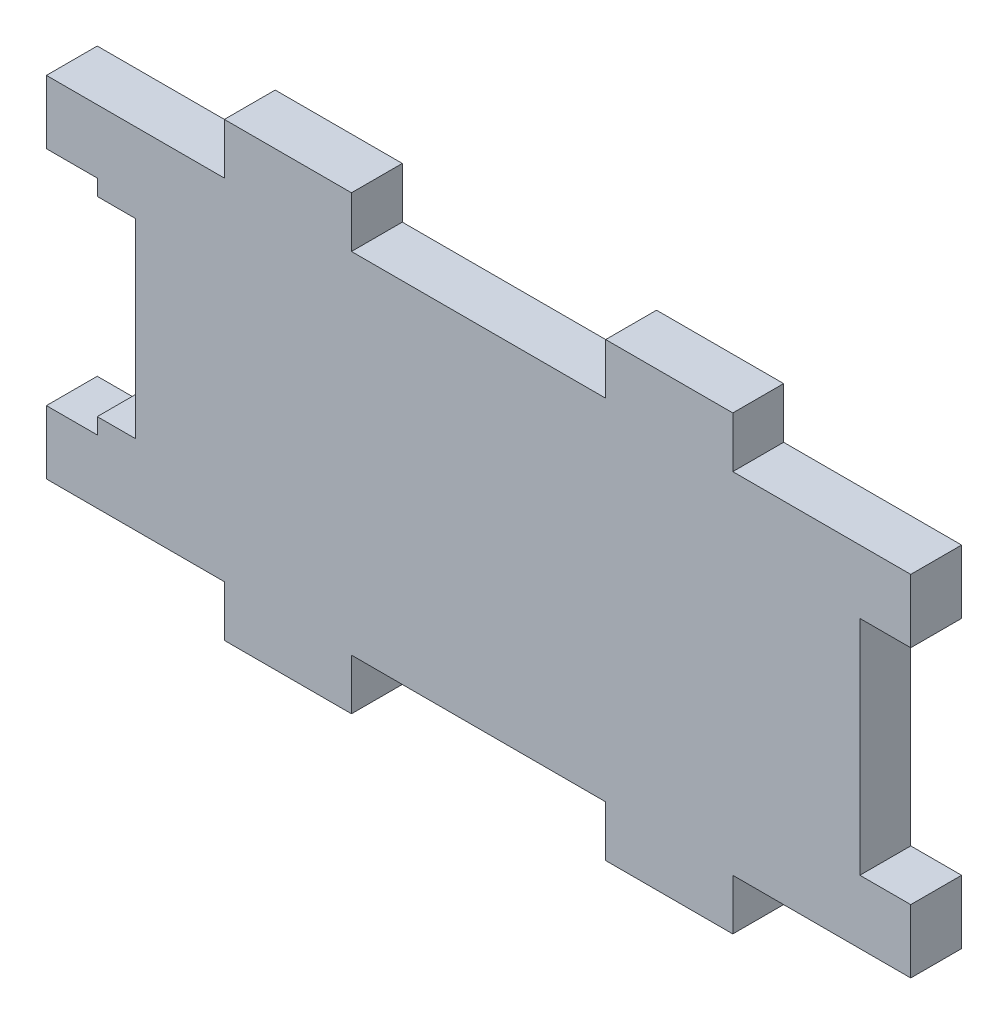
ISO-10303-21;
HEADER;
FILE_DESCRIPTION(('STEP AP214'),'2;1');
FILE_NAME('part.step','',(''),(''),'','','');
FILE_SCHEMA(('AUTOMOTIVE_DESIGN { 1 0 10303 214 1 1 1 1 }'));
ENDSEC;
DATA;
#1=APPLICATION_CONTEXT('core data for automotive mechanical design processes');
#2=APPLICATION_PROTOCOL_DEFINITION('international standard','automotive_design',2000,#1);
#3=PRODUCT_CONTEXT('',#1,'mechanical');
#4=PRODUCT('Part','Part','',(#3));
#5=PRODUCT_RELATED_PRODUCT_CATEGORY('part','',(#4));
#6=PRODUCT_DEFINITION_FORMATION('','',#4);
#7=PRODUCT_DEFINITION_CONTEXT('part definition',#1,'design');
#8=PRODUCT_DEFINITION('design','',#6,#7);
#9=PRODUCT_DEFINITION_SHAPE('','',#8);
#10=(LENGTH_UNIT() NAMED_UNIT(*) SI_UNIT(.MILLI.,.METRE.));
#11=(NAMED_UNIT(*) PLANE_ANGLE_UNIT() SI_UNIT($,.RADIAN.));
#12=(NAMED_UNIT(*) SI_UNIT($,.STERADIAN.) SOLID_ANGLE_UNIT());
#13=UNCERTAINTY_MEASURE_WITH_UNIT(LENGTH_MEASURE(1.E-05),#10,'distance_accuracy_value','');
#14=(GEOMETRIC_REPRESENTATION_CONTEXT(3) GLOBAL_UNCERTAINTY_ASSIGNED_CONTEXT((#13)) GLOBAL_UNIT_ASSIGNED_CONTEXT((#10,
#11,#12)) REPRESENTATION_CONTEXT('',''));
#15=CARTESIAN_POINT('',(0.,0.,0.));
#16=DIRECTION('',(0.,0.,1.));
#17=DIRECTION('',(1.,0.,0.));
#18=AXIS2_PLACEMENT_3D('',#15,#16,#17);
#19=CARTESIAN_POINT('',(-60.,27.5,8.));
#20=DIRECTION('',(0.,-1.,0.));
#21=DIRECTION('',(0.,0.,-1.));
#22=AXIS2_PLACEMENT_3D('',#19,#20,#21);
#23=PLANE('',#22);
#24=DIRECTION('',(-1.,0.,0.));
#25=VECTOR('',#24,1.);
#26=CARTESIAN_POINT('',(-60.,27.5,0.));
#27=LINE('',#26,#25);
#28=CARTESIAN_POINT('',(68.,27.5,0.));
#29=VERTEX_POINT('',#28);
#30=CARTESIAN_POINT('',(40.,27.5,0.));
#31=VERTEX_POINT('',#30);
#32=EDGE_CURVE('E42',#29,#31,#27,.T.);
#33=ORIENTED_EDGE('',*,*,#32,.T.);
#34=DIRECTION('',(0.,0.,1.));
#35=VECTOR('',#34,1.);
#36=CARTESIAN_POINT('',(40.,27.5,8.00000000000001));
#37=LINE('',#36,#35);
#38=CARTESIAN_POINT('',(40.,27.5,8.));
#39=VERTEX_POINT('',#38);
#40=EDGE_CURVE('E309',#31,#39,#37,.T.);
#41=ORIENTED_EDGE('',*,*,#40,.T.);
#42=DIRECTION('',(-1.,0.,0.));
#43=VECTOR('',#42,1.);
#44=CARTESIAN_POINT('',(-60.,27.5,8.));
#45=LINE('',#44,#43);
#46=CARTESIAN_POINT('',(68.,27.5,8.));
#47=VERTEX_POINT('',#46);
#48=EDGE_CURVE('E11',#47,#39,#45,.T.);
#49=ORIENTED_EDGE('',*,*,#48,.F.);
#50=DIRECTION('',(0.,0.,1.));
#51=VECTOR('',#50,1.);
#52=CARTESIAN_POINT('',(68.,27.5,8.));
#53=LINE('',#52,#51);
#54=EDGE_CURVE('E445',#29,#47,#53,.T.);
#55=ORIENTED_EDGE('',*,*,#54,.F.);
#56=EDGE_LOOP('',(#33,#41,#49,#55));
#57=FACE_BOUND('',#56,.T.);
#58=ADVANCED_FACE('F38',(#57),#23,.F.);
#59=CARTESIAN_POINT('',(-40.,27.5,8.));
#60=VERTEX_POINT('',#59);
#61=CARTESIAN_POINT('',(-68.,27.5,8.));
#62=VERTEX_POINT('',#61);
#63=EDGE_CURVE('E49',#60,#62,#45,.T.);
#64=ORIENTED_EDGE('',*,*,#63,.F.);
#65=DIRECTION('',(0.,0.,-1.));
#66=VECTOR('',#65,1.);
#67=CARTESIAN_POINT('',(-40.,27.5,8.));
#68=LINE('',#67,#66);
#69=CARTESIAN_POINT('',(-40.,27.5,0.));
#70=VERTEX_POINT('',#69);
#71=EDGE_CURVE('E338',#60,#70,#68,.T.);
#72=ORIENTED_EDGE('',*,*,#71,.T.);
#73=CARTESIAN_POINT('',(-68.,27.5,0.));
#74=VERTEX_POINT('',#73);
#75=EDGE_CURVE('E491',#70,#74,#27,.T.);
#76=ORIENTED_EDGE('',*,*,#75,.T.);
#77=DIRECTION('',(0.,0.,1.));
#78=VECTOR('',#77,1.);
#79=CARTESIAN_POINT('',(-68.,27.5,8.));
#80=LINE('',#79,#78);
#81=EDGE_CURVE('E292',#74,#62,#80,.T.);
#82=ORIENTED_EDGE('',*,*,#81,.T.);
#83=EDGE_LOOP('',(#64,#72,#76,#82));
#84=FACE_BOUND('',#83,.T.);
#85=ADVANCED_FACE('F558',(#84),#23,.F.);
#86=CARTESIAN_POINT('',(-60.,-27.5,8.));
#87=DIRECTION('',(0.,1.,0.));
#88=DIRECTION('',(0.,0.,1.));
#89=AXIS2_PLACEMENT_3D('',#86,#87,#88);
#90=PLANE('',#89);
#91=DIRECTION('',(0.,0.,-1.));
#92=VECTOR('',#91,1.);
#93=CARTESIAN_POINT('',(20.,-27.5,8.00000000000001));
#94=LINE('',#93,#92);
#95=CARTESIAN_POINT('',(20.,-27.5,8.));
#96=VERTEX_POINT('',#95);
#97=CARTESIAN_POINT('',(20.,-27.5,0.));
#98=VERTEX_POINT('',#97);
#99=EDGE_CURVE('E366',#96,#98,#94,.T.);
#100=ORIENTED_EDGE('',*,*,#99,.F.);
#101=DIRECTION('',(1.,0.,0.));
#102=VECTOR('',#101,1.);
#103=CARTESIAN_POINT('',(-60.,-27.5,8.));
#104=LINE('',#103,#102);
#105=CARTESIAN_POINT('',(-20.,-27.5,8.));
#106=VERTEX_POINT('',#105);
#107=EDGE_CURVE('E263',#106,#96,#104,.T.);
#108=ORIENTED_EDGE('',*,*,#107,.F.);
#109=DIRECTION('',(0.,0.,1.));
#110=VECTOR('',#109,1.);
#111=CARTESIAN_POINT('',(-20.,-27.5,8.));
#112=LINE('',#111,#110);
#113=CARTESIAN_POINT('',(-20.,-27.5,0.));
#114=VERTEX_POINT('',#113);
#115=EDGE_CURVE('E397',#114,#106,#112,.T.);
#116=ORIENTED_EDGE('',*,*,#115,.F.);
#117=DIRECTION('',(1.,0.,0.));
#118=VECTOR('',#117,1.);
#119=CARTESIAN_POINT('',(-60.,-27.5,0.));
#120=LINE('',#119,#118);
#121=EDGE_CURVE('E490',#114,#98,#120,.T.);
#122=ORIENTED_EDGE('',*,*,#121,.T.);
#123=EDGE_LOOP('',(#100,#108,#116,#122));
#124=FACE_BOUND('',#123,.T.);
#125=ADVANCED_FACE('F523',(#124),#90,.F.);
#126=DIRECTION('',(0.,0.,1.));
#127=VECTOR('',#126,1.);
#128=CARTESIAN_POINT('',(40.,-27.5,8.00000000000001));
#129=LINE('',#128,#127);
#130=CARTESIAN_POINT('',(40.,-27.5,0.));
#131=VERTEX_POINT('',#130);
#132=CARTESIAN_POINT('',(40.,-27.5,8.));
#133=VERTEX_POINT('',#132);
#134=EDGE_CURVE('E371',#131,#133,#129,.T.);
#135=ORIENTED_EDGE('',*,*,#134,.F.);
#136=CARTESIAN_POINT('',(68.,-27.5,0.));
#137=VERTEX_POINT('',#136);
#138=EDGE_CURVE('E487',#131,#137,#120,.T.);
#139=ORIENTED_EDGE('',*,*,#138,.T.);
#140=DIRECTION('',(0.,0.,-1.));
#141=VECTOR('',#140,1.);
#142=CARTESIAN_POINT('',(68.,-27.5,8.));
#143=LINE('',#142,#141);
#144=CARTESIAN_POINT('',(68.,-27.5,8.));
#145=VERTEX_POINT('',#144);
#146=EDGE_CURVE('E418',#145,#137,#143,.T.);
#147=ORIENTED_EDGE('',*,*,#146,.F.);
#148=EDGE_CURVE('E265',#133,#145,#104,.T.);
#149=ORIENTED_EDGE('',*,*,#148,.F.);
#150=EDGE_LOOP('',(#135,#139,#147,#149));
#151=FACE_BOUND('',#150,.T.);
#152=ADVANCED_FACE('F530',(#151),#90,.F.);
#153=DIRECTION('',(0.,0.,-1.));
#154=VECTOR('',#153,1.);
#155=CARTESIAN_POINT('',(-40.,-27.5,8.));
#156=LINE('',#155,#154);
#157=CARTESIAN_POINT('',(-40.,-27.5,8.));
#158=VERTEX_POINT('',#157);
#159=CARTESIAN_POINT('',(-40.,-27.5,0.));
#160=VERTEX_POINT('',#159);
#161=EDGE_CURVE('E257',#158,#160,#156,.T.);
#162=ORIENTED_EDGE('',*,*,#161,.F.);
#163=CARTESIAN_POINT('',(-68.,-27.5,8.));
#164=VERTEX_POINT('',#163);
#165=EDGE_CURVE('E251',#164,#158,#104,.T.);
#166=ORIENTED_EDGE('',*,*,#165,.F.);
#167=DIRECTION('',(0.,0.,-1.));
#168=VECTOR('',#167,1.);
#169=CARTESIAN_POINT('',(-68.,-27.5,8.));
#170=LINE('',#169,#168);
#171=CARTESIAN_POINT('',(-68.,-27.5,0.));
#172=VERTEX_POINT('',#171);
#173=EDGE_CURVE('E254',#164,#172,#170,.T.);
#174=ORIENTED_EDGE('',*,*,#173,.T.);
#175=EDGE_CURVE('E488',#172,#160,#120,.T.);
#176=ORIENTED_EDGE('',*,*,#175,.T.);
#177=EDGE_LOOP('',(#162,#166,#174,#176));
#178=FACE_BOUND('',#177,.T.);
#179=ADVANCED_FACE('F253',(#178),#90,.F.);
#180=CARTESIAN_POINT('',(60.,27.5,8.));
#181=DIRECTION('',(-1.,0.,0.));
#182=DIRECTION('',(0.,0.,1.));
#183=AXIS2_PLACEMENT_3D('',#180,#181,#182);
#184=PLANE('',#183);
#185=DIRECTION('',(0.,0.,1.));
#186=VECTOR('',#185,1.);
#187=CARTESIAN_POINT('',(60.,-17.5,8.));
#188=LINE('',#187,#186);
#189=CARTESIAN_POINT('',(60.,-17.5,0.));
#190=VERTEX_POINT('',#189);
#191=CARTESIAN_POINT('',(60.,-17.5,8.));
#192=VERTEX_POINT('',#191);
#193=EDGE_CURVE('E417',#190,#192,#188,.T.);
#194=ORIENTED_EDGE('',*,*,#193,.F.);
#195=DIRECTION('',(0.,1.,0.));
#196=VECTOR('',#195,1.);
#197=CARTESIAN_POINT('',(60.,27.5,0.));
#198=LINE('',#197,#196);
#199=CARTESIAN_POINT('',(60.,17.5,0.));
#200=VERTEX_POINT('',#199);
#201=EDGE_CURVE('E489',#190,#200,#198,.T.);
#202=ORIENTED_EDGE('',*,*,#201,.T.);
#203=DIRECTION('',(0.,0.,-1.));
#204=VECTOR('',#203,1.);
#205=CARTESIAN_POINT('',(60.,17.5,8.));
#206=LINE('',#205,#204);
#207=CARTESIAN_POINT('',(60.,17.5,8.));
#208=VERTEX_POINT('',#207);
#209=EDGE_CURVE('E436',#208,#200,#206,.T.);
#210=ORIENTED_EDGE('',*,*,#209,.F.);
#211=DIRECTION('',(0.,1.,0.));
#212=VECTOR('',#211,1.);
#213=CARTESIAN_POINT('',(60.,27.5,8.));
#214=LINE('',#213,#212);
#215=EDGE_CURVE('E262',#192,#208,#214,.T.);
#216=ORIENTED_EDGE('',*,*,#215,.F.);
#217=EDGE_LOOP('',(#194,#202,#210,#216));
#218=FACE_BOUND('',#217,.T.);
#219=ADVANCED_FACE('F595',(#218),#184,.F.);
#220=CARTESIAN_POINT('',(-60.,27.5,8.));
#221=DIRECTION('',(1.,0.,0.));
#222=DIRECTION('',(0.,0.,-1.));
#223=AXIS2_PLACEMENT_3D('',#220,#221,#222);
#224=PLANE('',#223);
#225=DIRECTION('',(0.,-1.,0.));
#226=VECTOR('',#225,1.);
#227=CARTESIAN_POINT('',(-60.,27.5,8.));
#228=LINE('',#227,#226);
#229=CARTESIAN_POINT('',(-60.,17.5,8.));
#230=VERTEX_POINT('',#229);
#231=CARTESIAN_POINT('',(-60.,15.,8.));
#232=VERTEX_POINT('',#231);
#233=EDGE_CURVE('E481',#230,#232,#228,.T.);
#234=ORIENTED_EDGE('',*,*,#233,.F.);
#235=DIRECTION('',(0.,0.,-1.));
#236=VECTOR('',#235,1.);
#237=CARTESIAN_POINT('',(-60.,17.5,8.));
#238=LINE('',#237,#236);
#239=CARTESIAN_POINT('',(-60.,17.5,0.));
#240=VERTEX_POINT('',#239);
#241=EDGE_CURVE('E288',#230,#240,#238,.T.);
#242=ORIENTED_EDGE('',*,*,#241,.T.);
#243=DIRECTION('',(0.,-1.,0.));
#244=VECTOR('',#243,1.);
#245=CARTESIAN_POINT('',(-60.,27.5,0.));
#246=LINE('',#245,#244);
#247=CARTESIAN_POINT('',(-60.,15.,0.));
#248=VERTEX_POINT('',#247);
#249=EDGE_CURVE('E485',#240,#248,#246,.T.);
#250=ORIENTED_EDGE('',*,*,#249,.T.);
#251=DIRECTION('',(0.,0.,-1.));
#252=VECTOR('',#251,1.);
#253=CARTESIAN_POINT('',(-60.,15.,-0.000999999999999265));
#254=LINE('',#253,#252);
#255=EDGE_CURVE('E458',#232,#248,#254,.T.);
#256=ORIENTED_EDGE('',*,*,#255,.F.);
#257=EDGE_LOOP('',(#234,#242,#250,#256));
#258=FACE_BOUND('',#257,.T.);
#259=ADVANCED_FACE('F573',(#258),#224,.F.);
#260=CARTESIAN_POINT('',(-60.,-15.,0.));
#261=VERTEX_POINT('',#260);
#262=CARTESIAN_POINT('',(-60.,-17.5,0.));
#263=VERTEX_POINT('',#262);
#264=EDGE_CURVE('E61',#261,#263,#246,.T.);
#265=ORIENTED_EDGE('',*,*,#264,.T.);
#266=DIRECTION('',(0.,0.,1.));
#267=VECTOR('',#266,1.);
#268=CARTESIAN_POINT('',(-60.,-17.5,8.));
#269=LINE('',#268,#267);
#270=CARTESIAN_POINT('',(-60.,-17.5,8.));
#271=VERTEX_POINT('',#270);
#272=EDGE_CURVE('E56',#263,#271,#269,.T.);
#273=ORIENTED_EDGE('',*,*,#272,.T.);
#274=CARTESIAN_POINT('',(-60.,-15.,8.));
#275=VERTEX_POINT('',#274);
#276=EDGE_CURVE('E482',#275,#271,#228,.T.);
#277=ORIENTED_EDGE('',*,*,#276,.F.);
#278=DIRECTION('',(0.,0.,1.));
#279=VECTOR('',#278,1.);
#280=CARTESIAN_POINT('',(-60.,-15.,-0.000999999999999265));
#281=LINE('',#280,#279);
#282=EDGE_CURVE('E456',#261,#275,#281,.T.);
#283=ORIENTED_EDGE('',*,*,#282,.F.);
#284=EDGE_LOOP('',(#265,#273,#277,#283));
#285=FACE_BOUND('',#284,.T.);
#286=ADVANCED_FACE('F40',(#285),#224,.F.);
#287=CARTESIAN_POINT('',(20.,27.5,8.));
#288=VERTEX_POINT('',#287);
#289=CARTESIAN_POINT('',(-20.,27.5,8.));
#290=VERTEX_POINT('',#289);
#291=EDGE_CURVE('E47',#288,#290,#45,.T.);
#292=ORIENTED_EDGE('',*,*,#291,.F.);
#293=DIRECTION('',(0.,0.,-1.));
#294=VECTOR('',#293,1.);
#295=CARTESIAN_POINT('',(20.,27.5,8.00000000000001));
#296=LINE('',#295,#294);
#297=CARTESIAN_POINT('',(20.,27.5,0.));
#298=VERTEX_POINT('',#297);
#299=EDGE_CURVE('E314',#288,#298,#296,.T.);
#300=ORIENTED_EDGE('',*,*,#299,.T.);
#301=CARTESIAN_POINT('',(-20.,27.5,0.));
#302=VERTEX_POINT('',#301);
#303=EDGE_CURVE('E495',#298,#302,#27,.T.);
#304=ORIENTED_EDGE('',*,*,#303,.T.);
#305=DIRECTION('',(0.,0.,1.));
#306=VECTOR('',#305,1.);
#307=CARTESIAN_POINT('',(-20.,27.5,8.));
#308=LINE('',#307,#306);
#309=EDGE_CURVE('E343',#302,#290,#308,.T.);
#310=ORIENTED_EDGE('',*,*,#309,.T.);
#311=EDGE_LOOP('',(#292,#300,#304,#310));
#312=FACE_BOUND('',#311,.T.);
#313=ADVANCED_FACE('F560',(#312),#23,.F.);
#314=CARTESIAN_POINT('',(0.,0.,8.));
#315=DIRECTION('',(0.,0.,1.));
#316=DIRECTION('',(1.,0.,0.));
#317=AXIS2_PLACEMENT_3D('',#314,#315,#316);
#318=PLANE('',#317);
#319=DIRECTION('',(-1.,0.,0.));
#320=VECTOR('',#319,1.);
#321=CARTESIAN_POINT('',(-92.7508153269363,15.,8.));
#322=LINE('',#321,#320);
#323=CARTESIAN_POINT('',(-54.,15.,8.));
#324=VERTEX_POINT('',#323);
#325=EDGE_CURVE('E472',#324,#232,#322,.T.);
#326=ORIENTED_EDGE('',*,*,#325,.F.);
#327=DIRECTION('',(0.,1.,0.));
#328=VECTOR('',#327,1.);
#329=CARTESIAN_POINT('',(-54.,15.,8.));
#330=LINE('',#329,#328);
#331=CARTESIAN_POINT('',(-54.,-15.,8.));
#332=VERTEX_POINT('',#331);
#333=EDGE_CURVE('E469',#332,#324,#330,.T.);
#334=ORIENTED_EDGE('',*,*,#333,.F.);
#335=DIRECTION('',(1.,0.,0.));
#336=VECTOR('',#335,1.);
#337=CARTESIAN_POINT('',(-92.7508153269363,-15.,8.));
#338=LINE('',#337,#336);
#339=EDGE_CURVE('E466',#275,#332,#338,.T.);
#340=ORIENTED_EDGE('',*,*,#339,.F.);
#341=ORIENTED_EDGE('',*,*,#276,.T.);
#342=DIRECTION('',(1.,0.,0.));
#343=VECTOR('',#342,1.);
#344=CARTESIAN_POINT('',(-68.,-17.5,8.));
#345=LINE('',#344,#343);
#346=CARTESIAN_POINT('',(-68.,-17.5,8.));
#347=VERTEX_POINT('',#346);
#348=EDGE_CURVE('E278',#347,#271,#345,.T.);
#349=ORIENTED_EDGE('',*,*,#348,.F.);
#350=DIRECTION('',(0.,-1.,0.));
#351=VECTOR('',#350,1.);
#352=CARTESIAN_POINT('',(-68.,-27.5,8.));
#353=LINE('',#352,#351);
#354=EDGE_CURVE('E270',#347,#164,#353,.T.);
#355=ORIENTED_EDGE('',*,*,#354,.T.);
#356=ORIENTED_EDGE('',*,*,#165,.T.);
#357=DIRECTION('',(0.,1.,0.));
#358=VECTOR('',#357,1.);
#359=CARTESIAN_POINT('',(-40.,-35.5,8.));
#360=LINE('',#359,#358);
#361=CARTESIAN_POINT('',(-40.,-35.5,8.));
#362=VERTEX_POINT('',#361);
#363=EDGE_CURVE('E403',#362,#158,#360,.T.);
#364=ORIENTED_EDGE('',*,*,#363,.F.);
#365=DIRECTION('',(-1.,0.,0.));
#366=VECTOR('',#365,1.);
#367=CARTESIAN_POINT('',(-40.,-35.5,8.));
#368=LINE('',#367,#366);
#369=CARTESIAN_POINT('',(-20.,-35.5,8.));
#370=VERTEX_POINT('',#369);
#371=EDGE_CURVE('E401',#370,#362,#368,.T.);
#372=ORIENTED_EDGE('',*,*,#371,.F.);
#373=DIRECTION('',(0.,1.,0.));
#374=VECTOR('',#373,1.);
#375=CARTESIAN_POINT('',(-20.,-35.5,8.));
#376=LINE('',#375,#374);
#377=EDGE_CURVE('E408',#370,#106,#376,.T.);
#378=ORIENTED_EDGE('',*,*,#377,.T.);
#379=ORIENTED_EDGE('',*,*,#107,.T.);
#380=DIRECTION('',(0.,1.,0.));
#381=VECTOR('',#380,1.);
#382=CARTESIAN_POINT('',(20.,-35.5,8.00000000000001));
#383=LINE('',#382,#381);
#384=CARTESIAN_POINT('',(20.,-35.5,8.00000000000001));
#385=VERTEX_POINT('',#384);
#386=EDGE_CURVE('E390',#385,#96,#383,.T.);
#387=ORIENTED_EDGE('',*,*,#386,.F.);
#388=DIRECTION('',(-1.,0.,0.));
#389=VECTOR('',#388,1.);
#390=CARTESIAN_POINT('',(40.,-35.5,8.00000000000001));
#391=LINE('',#390,#389);
#392=CARTESIAN_POINT('',(40.,-35.5,8.00000000000001));
#393=VERTEX_POINT('',#392);
#394=EDGE_CURVE('E367',#393,#385,#391,.T.);
#395=ORIENTED_EDGE('',*,*,#394,.F.);
#396=DIRECTION('',(0.,1.,0.));
#397=VECTOR('',#396,1.);
#398=CARTESIAN_POINT('',(40.,-35.5,8.00000000000001));
#399=LINE('',#398,#397);
#400=EDGE_CURVE('E377',#393,#133,#399,.T.);
#401=ORIENTED_EDGE('',*,*,#400,.T.);
#402=ORIENTED_EDGE('',*,*,#148,.T.);
#403=DIRECTION('',(0.,-1.,0.));
#404=VECTOR('',#403,1.);
#405=CARTESIAN_POINT('',(68.,-27.5,8.));
#406=LINE('',#405,#404);
#407=CARTESIAN_POINT('',(68.,-17.5,8.));
#408=VERTEX_POINT('',#407);
#409=EDGE_CURVE('E425',#408,#145,#406,.T.);
#410=ORIENTED_EDGE('',*,*,#409,.F.);
#411=DIRECTION('',(-1.,0.,0.));
#412=VECTOR('',#411,1.);
#413=CARTESIAN_POINT('',(68.,-17.5,8.));
#414=LINE('',#413,#412);
#415=EDGE_CURVE('E428',#408,#192,#414,.T.);
#416=ORIENTED_EDGE('',*,*,#415,.T.);
#417=ORIENTED_EDGE('',*,*,#215,.T.);
#418=DIRECTION('',(-1.,0.,0.));
#419=VECTOR('',#418,1.);
#420=CARTESIAN_POINT('',(68.,17.5,8.));
#421=LINE('',#420,#419);
#422=CARTESIAN_POINT('',(68.,17.5,8.));
#423=VERTEX_POINT('',#422);
#424=EDGE_CURVE('E453',#423,#208,#421,.T.);
#425=ORIENTED_EDGE('',*,*,#424,.F.);
#426=DIRECTION('',(0.,-1.,0.));
#427=VECTOR('',#426,1.);
#428=CARTESIAN_POINT('',(68.,27.5,8.));
#429=LINE('',#428,#427);
#430=EDGE_CURVE('E437',#47,#423,#429,.T.);
#431=ORIENTED_EDGE('',*,*,#430,.F.);
#432=ORIENTED_EDGE('',*,*,#48,.T.);
#433=DIRECTION('',(0.,-1.,0.));
#434=VECTOR('',#433,1.);
#435=CARTESIAN_POINT('',(40.,35.5,8.00000000000001));
#436=LINE('',#435,#434);
#437=CARTESIAN_POINT('',(40.,35.5,8.00000000000001));
#438=VERTEX_POINT('',#437);
#439=EDGE_CURVE('E335',#438,#39,#436,.T.);
#440=ORIENTED_EDGE('',*,*,#439,.F.);
#441=DIRECTION('',(-1.,0.,0.));
#442=VECTOR('',#441,1.);
#443=CARTESIAN_POINT('',(40.,35.5,8.00000000000001));
#444=LINE('',#443,#442);
#445=CARTESIAN_POINT('',(20.,35.5,8.00000000000001));
#446=VERTEX_POINT('',#445);
#447=EDGE_CURVE('E310',#438,#446,#444,.T.);
#448=ORIENTED_EDGE('',*,*,#447,.T.);
#449=DIRECTION('',(0.,-1.,0.));
#450=VECTOR('',#449,1.);
#451=CARTESIAN_POINT('',(20.,35.5,8.00000000000001));
#452=LINE('',#451,#450);
#453=EDGE_CURVE('E323',#446,#288,#452,.T.);
#454=ORIENTED_EDGE('',*,*,#453,.T.);
#455=ORIENTED_EDGE('',*,*,#291,.T.);
#456=DIRECTION('',(0.,-1.,0.));
#457=VECTOR('',#456,1.);
#458=CARTESIAN_POINT('',(-20.,35.5,8.));
#459=LINE('',#458,#457);
#460=CARTESIAN_POINT('',(-20.,35.5,8.));
#461=VERTEX_POINT('',#460);
#462=EDGE_CURVE('E361',#461,#290,#459,.T.);
#463=ORIENTED_EDGE('',*,*,#462,.F.);
#464=DIRECTION('',(-1.,0.,0.));
#465=VECTOR('',#464,1.);
#466=CARTESIAN_POINT('',(-40.,35.5,8.));
#467=LINE('',#466,#465);
#468=CARTESIAN_POINT('',(-40.,35.5,8.));
#469=VERTEX_POINT('',#468);
#470=EDGE_CURVE('E342',#461,#469,#467,.T.);
#471=ORIENTED_EDGE('',*,*,#470,.T.);
#472=DIRECTION('',(0.,-1.,0.));
#473=VECTOR('',#472,1.);
#474=CARTESIAN_POINT('',(-40.,35.5,8.));
#475=LINE('',#474,#473);
#476=EDGE_CURVE('E364',#469,#60,#475,.T.);
#477=ORIENTED_EDGE('',*,*,#476,.T.);
#478=ORIENTED_EDGE('',*,*,#63,.T.);
#479=DIRECTION('',(0.,-1.,0.));
#480=VECTOR('',#479,1.);
#481=CARTESIAN_POINT('',(-68.,27.5,8.));
#482=LINE('',#481,#480);
#483=CARTESIAN_POINT('',(-68.,17.5,8.));
#484=VERTEX_POINT('',#483);
#485=EDGE_CURVE('E289',#62,#484,#482,.T.);
#486=ORIENTED_EDGE('',*,*,#485,.T.);
#487=DIRECTION('',(1.,0.,0.));
#488=VECTOR('',#487,1.);
#489=CARTESIAN_POINT('',(-68.,17.5,8.));
#490=LINE('',#489,#488);
#491=EDGE_CURVE('E301',#484,#230,#490,.T.);
#492=ORIENTED_EDGE('',*,*,#491,.T.);
#493=ORIENTED_EDGE('',*,*,#233,.T.);
#494=EDGE_LOOP('',(#326,#334,#340,#341,#349,#355,#356,#364,#372,#378,#379,#387,#395,#401,#402,
#410,#416,#417,#425,#431,#432,#440,#448,#454,#455,#463,#471,#477,#478,#486,#492,#493));
#495=FACE_BOUND('',#494,.T.);
#496=ADVANCED_FACE('F276',(#495),#318,.T.);
#497=CARTESIAN_POINT('',(0.,0.,0.));
#498=DIRECTION('',(0.,0.,1.));
#499=DIRECTION('',(1.,0.,0.));
#500=AXIS2_PLACEMENT_3D('',#497,#498,#499);
#501=PLANE('',#500);
#502=DIRECTION('',(0.,-1.,0.));
#503=VECTOR('',#502,1.);
#504=CARTESIAN_POINT('',(-54.,15.,0.));
#505=LINE('',#504,#503);
#506=CARTESIAN_POINT('',(-54.,15.,0.));
#507=VERTEX_POINT('',#506);
#508=CARTESIAN_POINT('',(-54.,-15.,0.));
#509=VERTEX_POINT('',#508);
#510=EDGE_CURVE('E461',#507,#509,#505,.T.);
#511=ORIENTED_EDGE('',*,*,#510,.F.);
#512=DIRECTION('',(1.,0.,0.));
#513=VECTOR('',#512,1.);
#514=CARTESIAN_POINT('',(-92.7508153269363,15.,0.));
#515=LINE('',#514,#513);
#516=EDGE_CURVE('E463',#248,#507,#515,.T.);
#517=ORIENTED_EDGE('',*,*,#516,.F.);
#518=ORIENTED_EDGE('',*,*,#249,.F.);
#519=DIRECTION('',(1.,0.,0.));
#520=VECTOR('',#519,1.);
#521=CARTESIAN_POINT('',(-68.,17.5,0.));
#522=LINE('',#521,#520);
#523=CARTESIAN_POINT('',(-68.,17.5,0.));
#524=VERTEX_POINT('',#523);
#525=EDGE_CURVE('E306',#524,#240,#522,.T.);
#526=ORIENTED_EDGE('',*,*,#525,.F.);
#527=DIRECTION('',(0.,1.,0.));
#528=VECTOR('',#527,1.);
#529=CARTESIAN_POINT('',(-68.,27.5,0.));
#530=LINE('',#529,#528);
#531=EDGE_CURVE('E295',#524,#74,#530,.T.);
#532=ORIENTED_EDGE('',*,*,#531,.T.);
#533=ORIENTED_EDGE('',*,*,#75,.F.);
#534=DIRECTION('',(0.,-1.,0.));
#535=VECTOR('',#534,1.);
#536=CARTESIAN_POINT('',(-40.,35.5,0.));
#537=LINE('',#536,#535);
#538=CARTESIAN_POINT('',(-40.,35.5,0.));
#539=VERTEX_POINT('',#538);
#540=EDGE_CURVE('E352',#539,#70,#537,.T.);
#541=ORIENTED_EDGE('',*,*,#540,.F.);
#542=DIRECTION('',(1.,0.,0.));
#543=VECTOR('',#542,1.);
#544=CARTESIAN_POINT('',(-40.,35.5,0.));
#545=LINE('',#544,#543);
#546=CARTESIAN_POINT('',(-20.,35.5,0.));
#547=VERTEX_POINT('',#546);
#548=EDGE_CURVE('E349',#539,#547,#545,.T.);
#549=ORIENTED_EDGE('',*,*,#548,.T.);
#550=DIRECTION('',(0.,-1.,0.));
#551=VECTOR('',#550,1.);
#552=CARTESIAN_POINT('',(-20.,35.5,0.));
#553=LINE('',#552,#551);
#554=EDGE_CURVE('E358',#547,#302,#553,.T.);
#555=ORIENTED_EDGE('',*,*,#554,.T.);
#556=ORIENTED_EDGE('',*,*,#303,.F.);
#557=DIRECTION('',(0.,-1.,0.));
#558=VECTOR('',#557,1.);
#559=CARTESIAN_POINT('',(20.,35.5,0.));
#560=LINE('',#559,#558);
#561=CARTESIAN_POINT('',(20.,35.5,0.));
#562=VERTEX_POINT('',#561);
#563=EDGE_CURVE('E329',#562,#298,#560,.T.);
#564=ORIENTED_EDGE('',*,*,#563,.F.);
#565=DIRECTION('',(1.,0.,0.));
#566=VECTOR('',#565,1.);
#567=CARTESIAN_POINT('',(40.,35.5,0.));
#568=LINE('',#567,#566);
#569=CARTESIAN_POINT('',(40.,35.5,0.));
#570=VERTEX_POINT('',#569);
#571=EDGE_CURVE('E317',#562,#570,#568,.T.);
#572=ORIENTED_EDGE('',*,*,#571,.T.);
#573=DIRECTION('',(0.,-1.,0.));
#574=VECTOR('',#573,1.);
#575=CARTESIAN_POINT('',(40.,35.5,0.));
#576=LINE('',#575,#574);
#577=EDGE_CURVE('E332',#570,#31,#576,.T.);
#578=ORIENTED_EDGE('',*,*,#577,.T.);
#579=ORIENTED_EDGE('',*,*,#32,.F.);
#580=DIRECTION('',(0.,1.,0.));
#581=VECTOR('',#580,1.);
#582=CARTESIAN_POINT('',(68.,27.5,0.));
#583=LINE('',#582,#581);
#584=CARTESIAN_POINT('',(68.,17.5,0.));
#585=VERTEX_POINT('',#584);
#586=EDGE_CURVE('E442',#585,#29,#583,.T.);
#587=ORIENTED_EDGE('',*,*,#586,.F.);
#588=DIRECTION('',(-1.,0.,0.));
#589=VECTOR('',#588,1.);
#590=CARTESIAN_POINT('',(68.,17.5,0.));
#591=LINE('',#590,#589);
#592=EDGE_CURVE('E448',#585,#200,#591,.T.);
#593=ORIENTED_EDGE('',*,*,#592,.T.);
#594=ORIENTED_EDGE('',*,*,#201,.F.);
#595=DIRECTION('',(-1.,0.,0.));
#596=VECTOR('',#595,1.);
#597=CARTESIAN_POINT('',(68.,-17.5,0.));
#598=LINE('',#597,#596);
#599=CARTESIAN_POINT('',(68.,-17.5,0.));
#600=VERTEX_POINT('',#599);
#601=EDGE_CURVE('E433',#600,#190,#598,.T.);
#602=ORIENTED_EDGE('',*,*,#601,.F.);
#603=DIRECTION('',(0.,1.,0.));
#604=VECTOR('',#603,1.);
#605=CARTESIAN_POINT('',(68.,-27.5,0.));
#606=LINE('',#605,#604);
#607=EDGE_CURVE('E421',#137,#600,#606,.T.);
#608=ORIENTED_EDGE('',*,*,#607,.F.);
#609=ORIENTED_EDGE('',*,*,#138,.F.);
#610=DIRECTION('',(0.,1.,0.));
#611=VECTOR('',#610,1.);
#612=CARTESIAN_POINT('',(40.,-35.5,0.));
#613=LINE('',#612,#611);
#614=CARTESIAN_POINT('',(40.,-35.5,0.));
#615=VERTEX_POINT('',#614);
#616=EDGE_CURVE('E384',#615,#131,#613,.T.);
#617=ORIENTED_EDGE('',*,*,#616,.F.);
#618=DIRECTION('',(1.,0.,0.));
#619=VECTOR('',#618,1.);
#620=CARTESIAN_POINT('',(40.,-35.5,0.));
#621=LINE('',#620,#619);
#622=CARTESIAN_POINT('',(20.,-35.5,0.));
#623=VERTEX_POINT('',#622);
#624=EDGE_CURVE('E373',#623,#615,#621,.T.);
#625=ORIENTED_EDGE('',*,*,#624,.F.);
#626=DIRECTION('',(0.,1.,0.));
#627=VECTOR('',#626,1.);
#628=CARTESIAN_POINT('',(20.,-35.5,0.));
#629=LINE('',#628,#627);
#630=EDGE_CURVE('E387',#623,#98,#629,.T.);
#631=ORIENTED_EDGE('',*,*,#630,.T.);
#632=ORIENTED_EDGE('',*,*,#121,.F.);
#633=DIRECTION('',(0.,1.,0.));
#634=VECTOR('',#633,1.);
#635=CARTESIAN_POINT('',(-20.,-35.5,0.));
#636=LINE('',#635,#634);
#637=CARTESIAN_POINT('',(-20.,-35.5,0.));
#638=VERTEX_POINT('',#637);
#639=EDGE_CURVE('E411',#638,#114,#636,.T.);
#640=ORIENTED_EDGE('',*,*,#639,.F.);
#641=DIRECTION('',(1.,0.,0.));
#642=VECTOR('',#641,1.);
#643=CARTESIAN_POINT('',(-40.,-35.5,0.));
#644=LINE('',#643,#642);
#645=CARTESIAN_POINT('',(-40.,-35.5,0.));
#646=VERTEX_POINT('',#645);
#647=EDGE_CURVE('E396',#646,#638,#644,.T.);
#648=ORIENTED_EDGE('',*,*,#647,.F.);
#649=DIRECTION('',(0.,1.,0.));
#650=VECTOR('',#649,1.);
#651=CARTESIAN_POINT('',(-40.,-35.5,0.));
#652=LINE('',#651,#650);
#653=EDGE_CURVE('E414',#646,#160,#652,.T.);
#654=ORIENTED_EDGE('',*,*,#653,.T.);
#655=ORIENTED_EDGE('',*,*,#175,.F.);
#656=DIRECTION('',(0.,1.,0.));
#657=VECTOR('',#656,1.);
#658=CARTESIAN_POINT('',(-68.,-27.5,0.));
#659=LINE('',#658,#657);
#660=CARTESIAN_POINT('',(-68.,-17.5,0.));
#661=VERTEX_POINT('',#660);
#662=EDGE_CURVE('E273',#172,#661,#659,.T.);
#663=ORIENTED_EDGE('',*,*,#662,.T.);
#664=DIRECTION('',(1.,0.,0.));
#665=VECTOR('',#664,1.);
#666=CARTESIAN_POINT('',(-68.,-17.5,0.));
#667=LINE('',#666,#665);
#668=EDGE_CURVE('E284',#661,#263,#667,.T.);
#669=ORIENTED_EDGE('',*,*,#668,.T.);
#670=ORIENTED_EDGE('',*,*,#264,.F.);
#671=DIRECTION('',(-1.,0.,0.));
#672=VECTOR('',#671,1.);
#673=CARTESIAN_POINT('',(-92.7508153269363,-15.,0.));
#674=LINE('',#673,#672);
#675=EDGE_CURVE('E478',#509,#261,#674,.T.);
#676=ORIENTED_EDGE('',*,*,#675,.F.);
#677=EDGE_LOOP('',(#511,#517,#518,#526,#532,#533,#541,#549,#555,#556,#564,#572,#578,#579,#587,
#593,#594,#602,#608,#609,#617,#625,#631,#632,#640,#648,#654,#655,#663,#669,#670,#676));
#678=FACE_BOUND('',#677,.T.);
#679=ADVANCED_FACE('F507',(#678),#501,.F.);
#680=CARTESIAN_POINT('',(-92.7508153269363,15.,-0.000999999999999265));
#681=DIRECTION('',(0.,1.,0.));
#682=DIRECTION('',(0.,0.,1.));
#683=AXIS2_PLACEMENT_3D('',#680,#681,#682);
#684=PLANE('',#683);
#685=ORIENTED_EDGE('',*,*,#255,.T.);
#686=ORIENTED_EDGE('',*,*,#516,.T.);
#687=DIRECTION('',(0.,0.,1.));
#688=VECTOR('',#687,1.);
#689=CARTESIAN_POINT('',(-54.,15.,-0.000999999999999265));
#690=LINE('',#689,#688);
#691=EDGE_CURVE('E476',#507,#324,#690,.T.);
#692=ORIENTED_EDGE('',*,*,#691,.T.);
#693=ORIENTED_EDGE('',*,*,#325,.T.);
#694=EDGE_LOOP('',(#685,#686,#692,#693));
#695=FACE_BOUND('',#694,.T.);
#696=ADVANCED_FACE('F611',(#695),#684,.F.);
#697=CARTESIAN_POINT('',(-54.,15.,-0.000999999999999265));
#698=DIRECTION('',(1.,0.,0.));
#699=DIRECTION('',(0.,0.,-1.));
#700=AXIS2_PLACEMENT_3D('',#697,#698,#699);
#701=PLANE('',#700);
#702=ORIENTED_EDGE('',*,*,#510,.T.);
#703=DIRECTION('',(0.,0.,1.));
#704=VECTOR('',#703,1.);
#705=CARTESIAN_POINT('',(-54.,-15.,-0.000999999999999265));
#706=LINE('',#705,#704);
#707=EDGE_CURVE('E475',#509,#332,#706,.T.);
#708=ORIENTED_EDGE('',*,*,#707,.T.);
#709=ORIENTED_EDGE('',*,*,#333,.T.);
#710=ORIENTED_EDGE('',*,*,#691,.F.);
#711=EDGE_LOOP('',(#702,#708,#709,#710));
#712=FACE_BOUND('',#711,.T.);
#713=ADVANCED_FACE('F614',(#712),#701,.F.);
#714=CARTESIAN_POINT('',(-92.7508153269363,-15.,-0.000999999999999265));
#715=DIRECTION('',(0.,-1.,0.));
#716=DIRECTION('',(0.,0.,-1.));
#717=AXIS2_PLACEMENT_3D('',#714,#715,#716);
#718=PLANE('',#717);
#719=ORIENTED_EDGE('',*,*,#282,.T.);
#720=ORIENTED_EDGE('',*,*,#339,.T.);
#721=ORIENTED_EDGE('',*,*,#707,.F.);
#722=ORIENTED_EDGE('',*,*,#675,.T.);
#723=EDGE_LOOP('',(#719,#720,#721,#722));
#724=FACE_BOUND('',#723,.T.);
#725=ADVANCED_FACE('F610',(#724),#718,.F.);
#726=CARTESIAN_POINT('',(68.,17.5,8.));
#727=DIRECTION('',(0.,1.,0.));
#728=DIRECTION('',(0.,0.,1.));
#729=AXIS2_PLACEMENT_3D('',#726,#727,#728);
#730=PLANE('',#729);
#731=ORIENTED_EDGE('',*,*,#209,.T.);
#732=ORIENTED_EDGE('',*,*,#592,.F.);
#733=DIRECTION('',(0.,0.,-1.));
#734=VECTOR('',#733,1.);
#735=CARTESIAN_POINT('',(68.,17.5,8.));
#736=LINE('',#735,#734);
#737=EDGE_CURVE('E440',#423,#585,#736,.T.);
#738=ORIENTED_EDGE('',*,*,#737,.F.);
#739=ORIENTED_EDGE('',*,*,#424,.T.);
#740=EDGE_LOOP('',(#731,#732,#738,#739));
#741=FACE_BOUND('',#740,.T.);
#742=ADVANCED_FACE('F594',(#741),#730,.F.);
#743=CARTESIAN_POINT('',(68.,0.,0.));
#744=DIRECTION('',(1.,0.,0.));
#745=DIRECTION('',(0.,0.,-1.));
#746=AXIS2_PLACEMENT_3D('',#743,#744,#745);
#747=PLANE('',#746);
#748=ORIENTED_EDGE('',*,*,#430,.T.);
#749=ORIENTED_EDGE('',*,*,#737,.T.);
#750=ORIENTED_EDGE('',*,*,#586,.T.);
#751=ORIENTED_EDGE('',*,*,#54,.T.);
#752=EDGE_LOOP('',(#748,#749,#750,#751));
#753=FACE_BOUND('',#752,.T.);
#754=ADVANCED_FACE('F589',(#753),#747,.T.);
#755=CARTESIAN_POINT('',(68.,-17.5,8.));
#756=DIRECTION('',(0.,-1.,0.));
#757=DIRECTION('',(0.,0.,-1.));
#758=AXIS2_PLACEMENT_3D('',#755,#756,#757);
#759=PLANE('',#758);
#760=ORIENTED_EDGE('',*,*,#193,.T.);
#761=ORIENTED_EDGE('',*,*,#415,.F.);
#762=DIRECTION('',(0.,0.,1.));
#763=VECTOR('',#762,1.);
#764=CARTESIAN_POINT('',(68.,-17.5,8.));
#765=LINE('',#764,#763);
#766=EDGE_CURVE('E423',#600,#408,#765,.T.);
#767=ORIENTED_EDGE('',*,*,#766,.F.);
#768=ORIENTED_EDGE('',*,*,#601,.T.);
#769=EDGE_LOOP('',(#760,#761,#767,#768));
#770=FACE_BOUND('',#769,.T.);
#771=ADVANCED_FACE('F597',(#770),#759,.F.);
#772=CARTESIAN_POINT('',(68.,0.,0.));
#773=DIRECTION('',(1.,0.,0.));
#774=DIRECTION('',(0.,0.,-1.));
#775=AXIS2_PLACEMENT_3D('',#772,#773,#774);
#776=PLANE('',#775);
#777=ORIENTED_EDGE('',*,*,#146,.T.);
#778=ORIENTED_EDGE('',*,*,#607,.T.);
#779=ORIENTED_EDGE('',*,*,#766,.T.);
#780=ORIENTED_EDGE('',*,*,#409,.T.);
#781=EDGE_LOOP('',(#777,#778,#779,#780));
#782=FACE_BOUND('',#781,.T.);
#783=ADVANCED_FACE('F535',(#782),#776,.T.);
#784=CARTESIAN_POINT('',(-40.,-35.5,8.));
#785=DIRECTION('',(1.,0.,0.));
#786=DIRECTION('',(0.,0.,-1.));
#787=AXIS2_PLACEMENT_3D('',#784,#785,#786);
#788=PLANE('',#787);
#789=ORIENTED_EDGE('',*,*,#161,.T.);
#790=ORIENTED_EDGE('',*,*,#653,.F.);
#791=DIRECTION('',(0.,0.,-1.));
#792=VECTOR('',#791,1.);
#793=CARTESIAN_POINT('',(-40.,-35.5,8.));
#794=LINE('',#793,#792);
#795=EDGE_CURVE('E393',#362,#646,#794,.T.);
#796=ORIENTED_EDGE('',*,*,#795,.F.);
#797=ORIENTED_EDGE('',*,*,#363,.T.);
#798=EDGE_LOOP('',(#789,#790,#796,#797));
#799=FACE_BOUND('',#798,.T.);
#800=ADVANCED_FACE('F512',(#799),#788,.F.);
#801=CARTESIAN_POINT('',(-20.,-35.5,8.));
#802=DIRECTION('',(-1.,0.,0.));
#803=DIRECTION('',(0.,0.,1.));
#804=AXIS2_PLACEMENT_3D('',#801,#802,#803);
#805=PLANE('',#804);
#806=ORIENTED_EDGE('',*,*,#115,.T.);
#807=ORIENTED_EDGE('',*,*,#377,.F.);
#808=DIRECTION('',(0.,0.,1.));
#809=VECTOR('',#808,1.);
#810=CARTESIAN_POINT('',(-20.,-35.5,8.));
#811=LINE('',#810,#809);
#812=EDGE_CURVE('E399',#638,#370,#811,.T.);
#813=ORIENTED_EDGE('',*,*,#812,.F.);
#814=ORIENTED_EDGE('',*,*,#639,.T.);
#815=EDGE_LOOP('',(#806,#807,#813,#814));
#816=FACE_BOUND('',#815,.T.);
#817=ADVANCED_FACE('F520',(#816),#805,.F.);
#818=CARTESIAN_POINT('',(0.,-35.5,0.));
#819=DIRECTION('',(0.,-1.,0.));
#820=DIRECTION('',(0.,0.,-1.));
#821=AXIS2_PLACEMENT_3D('',#818,#819,#820);
#822=PLANE('',#821);
#823=ORIENTED_EDGE('',*,*,#795,.T.);
#824=ORIENTED_EDGE('',*,*,#647,.T.);
#825=ORIENTED_EDGE('',*,*,#812,.T.);
#826=ORIENTED_EDGE('',*,*,#371,.T.);
#827=EDGE_LOOP('',(#823,#824,#825,#826));
#828=FACE_BOUND('',#827,.T.);
#829=ADVANCED_FACE('F517',(#828),#822,.T.);
#830=CARTESIAN_POINT('',(20.,-35.5,8.00000000000001));
#831=DIRECTION('',(1.,0.,0.));
#832=DIRECTION('',(0.,0.,-1.));
#833=AXIS2_PLACEMENT_3D('',#830,#831,#832);
#834=PLANE('',#833);
#835=ORIENTED_EDGE('',*,*,#99,.T.);
#836=ORIENTED_EDGE('',*,*,#630,.F.);
#837=DIRECTION('',(0.,0.,-1.));
#838=VECTOR('',#837,1.);
#839=CARTESIAN_POINT('',(20.,-35.5,8.00000000000001));
#840=LINE('',#839,#838);
#841=EDGE_CURVE('E370',#385,#623,#840,.T.);
#842=ORIENTED_EDGE('',*,*,#841,.F.);
#843=ORIENTED_EDGE('',*,*,#386,.T.);
#844=EDGE_LOOP('',(#835,#836,#842,#843));
#845=FACE_BOUND('',#844,.T.);
#846=ADVANCED_FACE('F542',(#845),#834,.F.);
#847=CARTESIAN_POINT('',(40.,-35.5,8.00000000000001));
#848=DIRECTION('',(-1.,0.,0.));
#849=DIRECTION('',(0.,0.,1.));
#850=AXIS2_PLACEMENT_3D('',#847,#848,#849);
#851=PLANE('',#850);
#852=ORIENTED_EDGE('',*,*,#134,.T.);
#853=ORIENTED_EDGE('',*,*,#400,.F.);
#854=DIRECTION('',(0.,0.,1.));
#855=VECTOR('',#854,1.);
#856=CARTESIAN_POINT('',(40.,-35.5,8.00000000000001));
#857=LINE('',#856,#855);
#858=EDGE_CURVE('E375',#615,#393,#857,.T.);
#859=ORIENTED_EDGE('',*,*,#858,.F.);
#860=ORIENTED_EDGE('',*,*,#616,.T.);
#861=EDGE_LOOP('',(#852,#853,#859,#860));
#862=FACE_BOUND('',#861,.T.);
#863=ADVANCED_FACE('F547',(#862),#851,.F.);
#864=CARTESIAN_POINT('',(0.,-35.5,0.));
#865=DIRECTION('',(0.,-1.,0.));
#866=DIRECTION('',(0.,0.,-1.));
#867=AXIS2_PLACEMENT_3D('',#864,#865,#866);
#868=PLANE('',#867);
#869=ORIENTED_EDGE('',*,*,#394,.T.);
#870=ORIENTED_EDGE('',*,*,#841,.T.);
#871=ORIENTED_EDGE('',*,*,#624,.T.);
#872=ORIENTED_EDGE('',*,*,#858,.T.);
#873=EDGE_LOOP('',(#869,#870,#871,#872));
#874=FACE_BOUND('',#873,.T.);
#875=ADVANCED_FACE('F544',(#874),#868,.T.);
#876=CARTESIAN_POINT('',(-40.,35.5,8.));
#877=DIRECTION('',(-1.,0.,0.));
#878=DIRECTION('',(0.,0.,1.));
#879=AXIS2_PLACEMENT_3D('',#876,#877,#878);
#880=PLANE('',#879);
#881=ORIENTED_EDGE('',*,*,#71,.F.);
#882=ORIENTED_EDGE('',*,*,#476,.F.);
#883=DIRECTION('',(0.,0.,-1.));
#884=VECTOR('',#883,1.);
#885=CARTESIAN_POINT('',(-40.,35.5,8.));
#886=LINE('',#885,#884);
#887=EDGE_CURVE('E339',#469,#539,#886,.T.);
#888=ORIENTED_EDGE('',*,*,#887,.T.);
#889=ORIENTED_EDGE('',*,*,#540,.T.);
#890=EDGE_LOOP('',(#881,#882,#888,#889));
#891=FACE_BOUND('',#890,.T.);
#892=ADVANCED_FACE('F554',(#891),#880,.T.);
#893=CARTESIAN_POINT('',(-20.,35.5,8.));
#894=DIRECTION('',(1.,0.,0.));
#895=DIRECTION('',(0.,0.,-1.));
#896=AXIS2_PLACEMENT_3D('',#893,#894,#895);
#897=PLANE('',#896);
#898=ORIENTED_EDGE('',*,*,#309,.F.);
#899=ORIENTED_EDGE('',*,*,#554,.F.);
#900=DIRECTION('',(0.,0.,1.));
#901=VECTOR('',#900,1.);
#902=CARTESIAN_POINT('',(-20.,35.5,8.));
#903=LINE('',#902,#901);
#904=EDGE_CURVE('E346',#547,#461,#903,.T.);
#905=ORIENTED_EDGE('',*,*,#904,.T.);
#906=ORIENTED_EDGE('',*,*,#462,.T.);
#907=EDGE_LOOP('',(#898,#899,#905,#906));
#908=FACE_BOUND('',#907,.T.);
#909=ADVANCED_FACE('F740',(#908),#897,.T.);
#910=CARTESIAN_POINT('',(0.,35.5,0.));
#911=DIRECTION('',(0.,1.,0.));
#912=DIRECTION('',(0.,0.,-1.));
#913=AXIS2_PLACEMENT_3D('',#910,#911,#912);
#914=PLANE('',#913);
#915=ORIENTED_EDGE('',*,*,#887,.F.);
#916=ORIENTED_EDGE('',*,*,#470,.F.);
#917=ORIENTED_EDGE('',*,*,#904,.F.);
#918=ORIENTED_EDGE('',*,*,#548,.F.);
#919=EDGE_LOOP('',(#915,#916,#917,#918));
#920=FACE_BOUND('',#919,.T.);
#921=ADVANCED_FACE('F751',(#920),#914,.T.);
#922=CARTESIAN_POINT('',(40.,35.5,8.00000000000001));
#923=DIRECTION('',(1.,0.,0.));
#924=DIRECTION('',(0.,0.,-1.));
#925=AXIS2_PLACEMENT_3D('',#922,#923,#924);
#926=PLANE('',#925);
#927=ORIENTED_EDGE('',*,*,#40,.F.);
#928=ORIENTED_EDGE('',*,*,#577,.F.);
#929=DIRECTION('',(0.,0.,1.));
#930=VECTOR('',#929,1.);
#931=CARTESIAN_POINT('',(40.,35.5,8.00000000000001));
#932=LINE('',#931,#930);
#933=EDGE_CURVE('E313',#570,#438,#932,.T.);
#934=ORIENTED_EDGE('',*,*,#933,.T.);
#935=ORIENTED_EDGE('',*,*,#439,.T.);
#936=EDGE_LOOP('',(#927,#928,#934,#935));
#937=FACE_BOUND('',#936,.T.);
#938=ADVANCED_FACE('F586',(#937),#926,.T.);
#939=CARTESIAN_POINT('',(20.,35.5,8.00000000000001));
#940=DIRECTION('',(-1.,0.,0.));
#941=DIRECTION('',(0.,0.,1.));
#942=AXIS2_PLACEMENT_3D('',#939,#940,#941);
#943=PLANE('',#942);
#944=ORIENTED_EDGE('',*,*,#299,.F.);
#945=ORIENTED_EDGE('',*,*,#453,.F.);
#946=DIRECTION('',(0.,0.,-1.));
#947=VECTOR('',#946,1.);
#948=CARTESIAN_POINT('',(20.,35.5,8.00000000000001));
#949=LINE('',#948,#947);
#950=EDGE_CURVE('E320',#446,#562,#949,.T.);
#951=ORIENTED_EDGE('',*,*,#950,.T.);
#952=ORIENTED_EDGE('',*,*,#563,.T.);
#953=EDGE_LOOP('',(#944,#945,#951,#952));
#954=FACE_BOUND('',#953,.T.);
#955=ADVANCED_FACE('F579',(#954),#943,.T.);
#956=CARTESIAN_POINT('',(0.,35.5,0.));
#957=DIRECTION('',(0.,1.,0.));
#958=DIRECTION('',(0.,0.,-1.));
#959=AXIS2_PLACEMENT_3D('',#956,#957,#958);
#960=PLANE('',#959);
#961=ORIENTED_EDGE('',*,*,#447,.F.);
#962=ORIENTED_EDGE('',*,*,#933,.F.);
#963=ORIENTED_EDGE('',*,*,#571,.F.);
#964=ORIENTED_EDGE('',*,*,#950,.F.);
#965=EDGE_LOOP('',(#961,#962,#963,#964));
#966=FACE_BOUND('',#965,.T.);
#967=ADVANCED_FACE('F583',(#966),#960,.T.);
#968=CARTESIAN_POINT('',(-68.,17.5,8.));
#969=DIRECTION('',(0.,-1.,0.));
#970=DIRECTION('',(0.,0.,-1.));
#971=AXIS2_PLACEMENT_3D('',#968,#969,#970);
#972=PLANE('',#971);
#973=ORIENTED_EDGE('',*,*,#241,.F.);
#974=ORIENTED_EDGE('',*,*,#491,.F.);
#975=DIRECTION('',(0.,0.,-1.));
#976=VECTOR('',#975,1.);
#977=CARTESIAN_POINT('',(-68.,17.5,8.));
#978=LINE('',#977,#976);
#979=EDGE_CURVE('E298',#484,#524,#978,.T.);
#980=ORIENTED_EDGE('',*,*,#979,.T.);
#981=ORIENTED_EDGE('',*,*,#525,.T.);
#982=EDGE_LOOP('',(#973,#974,#980,#981));
#983=FACE_BOUND('',#982,.T.);
#984=ADVANCED_FACE('F786',(#983),#972,.T.);
#985=CARTESIAN_POINT('',(-68.,0.,0.));
#986=DIRECTION('',(-1.,0.,0.));
#987=DIRECTION('',(0.,0.,-1.));
#988=AXIS2_PLACEMENT_3D('',#985,#986,#987);
#989=PLANE('',#988);
#990=ORIENTED_EDGE('',*,*,#485,.F.);
#991=ORIENTED_EDGE('',*,*,#81,.F.);
#992=ORIENTED_EDGE('',*,*,#531,.F.);
#993=ORIENTED_EDGE('',*,*,#979,.F.);
#994=EDGE_LOOP('',(#990,#991,#992,#993));
#995=FACE_BOUND('',#994,.T.);
#996=ADVANCED_FACE('F841',(#995),#989,.T.);
#997=CARTESIAN_POINT('',(-68.,-17.5,8.));
#998=DIRECTION('',(0.,1.,0.));
#999=DIRECTION('',(0.,0.,1.));
#1000=AXIS2_PLACEMENT_3D('',#997,#998,#999);
#1001=PLANE('',#1000);
#1002=ORIENTED_EDGE('',*,*,#272,.F.);
#1003=ORIENTED_EDGE('',*,*,#668,.F.);
#1004=DIRECTION('',(0.,0.,1.));
#1005=VECTOR('',#1004,1.);
#1006=CARTESIAN_POINT('',(-68.,-17.5,8.));
#1007=LINE('',#1006,#1005);
#1008=EDGE_CURVE('E279',#661,#347,#1007,.T.);
#1009=ORIENTED_EDGE('',*,*,#1008,.T.);
#1010=ORIENTED_EDGE('',*,*,#348,.T.);
#1011=EDGE_LOOP('',(#1002,#1003,#1009,#1010));
#1012=FACE_BOUND('',#1011,.T.);
#1013=ADVANCED_FACE('F504',(#1012),#1001,.T.);
#1014=CARTESIAN_POINT('',(-68.,0.,0.));
#1015=DIRECTION('',(-1.,0.,0.));
#1016=DIRECTION('',(0.,0.,-1.));
#1017=AXIS2_PLACEMENT_3D('',#1014,#1015,#1016);
#1018=PLANE('',#1017);
#1019=ORIENTED_EDGE('',*,*,#173,.F.);
#1020=ORIENTED_EDGE('',*,*,#354,.F.);
#1021=ORIENTED_EDGE('',*,*,#1008,.F.);
#1022=ORIENTED_EDGE('',*,*,#662,.F.);
#1023=EDGE_LOOP('',(#1019,#1020,#1021,#1022));
#1024=FACE_BOUND('',#1023,.T.);
#1025=ADVANCED_FACE('F268',(#1024),#1018,.T.);
#1026=CLOSED_SHELL('',(#58,#85,#125,#152,#179,#219,#259,#286,#313,#496,#679,#696,#713,#725,#742,
#754,#771,#783,#800,#817,#829,#846,#863,#875,#892,#909,#921,#938,#955,#967,#984,#996,#1013,#1025));
#1027=MANIFOLD_SOLID_BREP('B2',#1026);
#1028=ADVANCED_BREP_SHAPE_REPRESENTATION('',(#18,#1027),#14);
#1029=SHAPE_DEFINITION_REPRESENTATION(#9,#1028);
ENDSEC;
END-ISO-10303-21;
